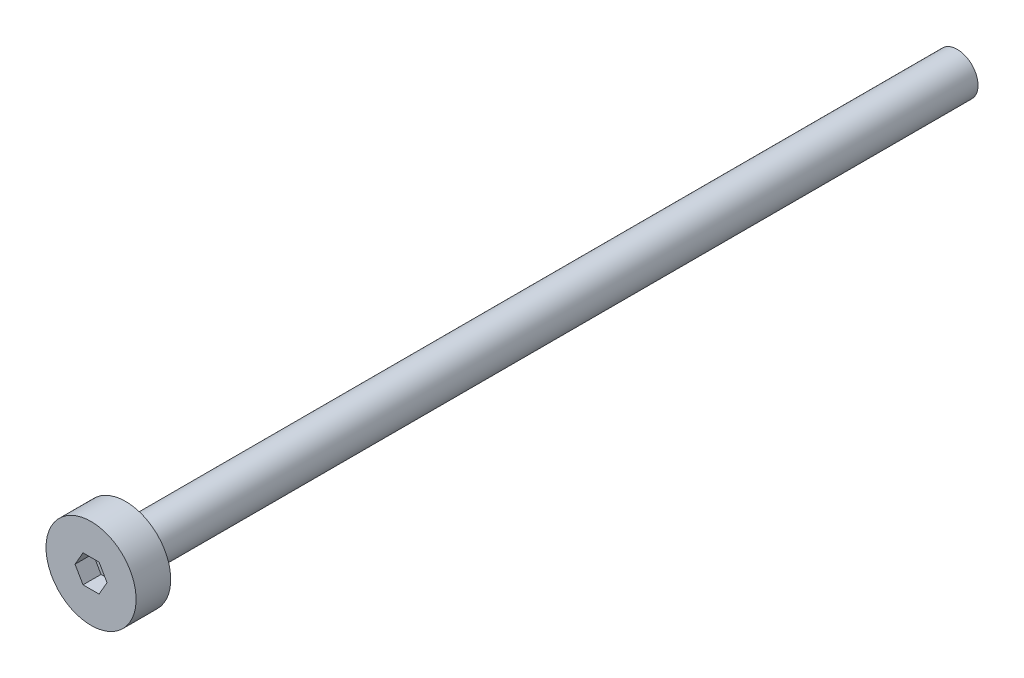
ISO-10303-21;
HEADER;
FILE_DESCRIPTION(('STEP AP214'),'2;1');
FILE_NAME('part.step','',(''),(''),'','','');
FILE_SCHEMA(('AUTOMOTIVE_DESIGN { 1 0 10303 214 1 1 1 1 }'));
ENDSEC;
DATA;
#1=APPLICATION_CONTEXT('core data for automotive mechanical design processes');
#2=APPLICATION_PROTOCOL_DEFINITION('international standard','automotive_design',2000,#1);
#3=PRODUCT_CONTEXT('',#1,'mechanical');
#4=PRODUCT('Part','Part','',(#3));
#5=PRODUCT_RELATED_PRODUCT_CATEGORY('part','',(#4));
#6=PRODUCT_DEFINITION_FORMATION('','',#4);
#7=PRODUCT_DEFINITION_CONTEXT('part definition',#1,'design');
#8=PRODUCT_DEFINITION('design','',#6,#7);
#9=PRODUCT_DEFINITION_SHAPE('','',#8);
#10=(LENGTH_UNIT() NAMED_UNIT(*) SI_UNIT(.MILLI.,.METRE.));
#11=(NAMED_UNIT(*) PLANE_ANGLE_UNIT() SI_UNIT($,.RADIAN.));
#12=(NAMED_UNIT(*) SI_UNIT($,.STERADIAN.) SOLID_ANGLE_UNIT());
#13=UNCERTAINTY_MEASURE_WITH_UNIT(LENGTH_MEASURE(1.E-05),#10,'distance_accuracy_value','');
#14=(GEOMETRIC_REPRESENTATION_CONTEXT(3) GLOBAL_UNCERTAINTY_ASSIGNED_CONTEXT((#13)) GLOBAL_UNIT_ASSIGNED_CONTEXT((#10,
#11,#12)) REPRESENTATION_CONTEXT('',''));
#15=CARTESIAN_POINT('',(0.,0.,0.));
#16=DIRECTION('',(0.,0.,1.));
#17=DIRECTION('',(1.,0.,0.));
#18=AXIS2_PLACEMENT_3D('',#15,#16,#17);
#19=CARTESIAN_POINT('',(0.,0.,1.2));
#20=DIRECTION('',(0.,0.,1.));
#21=DIRECTION('',(1.,0.,0.));
#22=AXIS2_PLACEMENT_3D('',#19,#20,#21);
#23=PLANE('',#22);
#24=DIRECTION('',(-0.50000000000019,0.866025403784329,0.));
#25=VECTOR('',#24,1.);
#26=CARTESIAN_POINT('',(1.154700538379,0.,1.2));
#27=LINE('',#26,#25);
#28=CARTESIAN_POINT('',(1.154700538379,0.,1.2));
#29=VERTEX_POINT('',#28);
#30=CARTESIAN_POINT('',(0.57735026919,1.,1.2));
#31=VERTEX_POINT('',#30);
#32=EDGE_CURVE('E9',#29,#31,#27,.T.);
#33=ORIENTED_EDGE('',*,*,#32,.T.);
#34=DIRECTION('',(-1.,0.,0.));
#35=VECTOR('',#34,1.);
#36=CARTESIAN_POINT('',(0.57735026919,1.,1.2));
#37=LINE('',#36,#35);
#38=CARTESIAN_POINT('',(-0.57735026919,1.,1.2));
#39=VERTEX_POINT('',#38);
#40=EDGE_CURVE('E135',#31,#39,#37,.T.);
#41=ORIENTED_EDGE('',*,*,#40,.T.);
#42=DIRECTION('',(-0.50000000000019,-0.866025403784329,0.));
#43=VECTOR('',#42,1.);
#44=CARTESIAN_POINT('',(-0.57735026919,1.,1.2));
#45=LINE('',#44,#43);
#46=CARTESIAN_POINT('',(-1.154700538379,0.,1.2));
#47=VERTEX_POINT('',#46);
#48=EDGE_CURVE('E157',#39,#47,#45,.T.);
#49=ORIENTED_EDGE('',*,*,#48,.T.);
#50=DIRECTION('',(0.50000000000019,-0.866025403784329,0.));
#51=VECTOR('',#50,1.);
#52=CARTESIAN_POINT('',(-1.154700538379,0.,1.2));
#53=LINE('',#52,#51);
#54=CARTESIAN_POINT('',(-0.57735026919,-1.,1.2));
#55=VERTEX_POINT('',#54);
#56=EDGE_CURVE('E107',#47,#55,#53,.T.);
#57=ORIENTED_EDGE('',*,*,#56,.T.);
#58=DIRECTION('',(1.,0.,0.));
#59=VECTOR('',#58,1.);
#60=CARTESIAN_POINT('',(-0.57735026919,-1.,1.2));
#61=LINE('',#60,#59);
#62=CARTESIAN_POINT('',(0.57735026919,-1.,1.2));
#63=VERTEX_POINT('',#62);
#64=EDGE_CURVE('E121',#55,#63,#61,.T.);
#65=ORIENTED_EDGE('',*,*,#64,.T.);
#66=DIRECTION('',(0.50000000000019,0.866025403784329,0.));
#67=VECTOR('',#66,1.);
#68=CARTESIAN_POINT('',(0.57735026919,-1.,1.2));
#69=LINE('',#68,#67);
#70=EDGE_CURVE('E117',#63,#29,#69,.T.);
#71=ORIENTED_EDGE('',*,*,#70,.T.);
#72=EDGE_LOOP('',(#33,#41,#49,#57,#65,#71));
#73=FACE_BOUND('',#72,.T.);
#74=ADVANCED_FACE('F14',(#73),#23,.T.);
#75=CARTESIAN_POINT('',(0.,0.,-60.));
#76=DIRECTION('',(0.,0.,-1.));
#77=DIRECTION('',(0.,-1.,0.));
#78=AXIS2_PLACEMENT_3D('',#75,#76,#77);
#79=PLANE('',#78);
#80=CARTESIAN_POINT('',(0.,0.,-60.));
#81=DIRECTION('',(0.,0.,-1.));
#82=DIRECTION('',(-1.,0.,0.));
#83=AXIS2_PLACEMENT_3D('',#80,#81,#82);
#84=CIRCLE('',#83,1.5);
#85=CARTESIAN_POINT('',(-1.5,0.,-60.));
#86=VERTEX_POINT('',#85);
#87=EDGE_CURVE('E18',#86,#86,#84,.T.);
#88=ORIENTED_EDGE('',*,*,#87,.T.);
#89=EDGE_LOOP('',(#88));
#90=FACE_BOUND('',#89,.T.);
#91=ADVANCED_FACE('F216',(#90),#79,.T.);
#92=CARTESIAN_POINT('',(1.154700538379,0.,1.2));
#93=DIRECTION('',(-0.866025403784329,-0.50000000000019,0.));
#94=DIRECTION('',(-0.50000000000019,0.866025403784329,0.));
#95=AXIS2_PLACEMENT_3D('',#92,#93,#94);
#96=PLANE('',#95);
#97=ORIENTED_EDGE('',*,*,#32,.F.);
#98=DIRECTION('',(0.,0.,1.));
#99=VECTOR('',#98,1.);
#100=CARTESIAN_POINT('',(1.154700538379,0.,1.2));
#101=LINE('',#100,#99);
#102=CARTESIAN_POINT('',(1.154700538379,0.,2.5));
#103=VERTEX_POINT('',#102);
#104=EDGE_CURVE('E114',#29,#103,#101,.T.);
#105=ORIENTED_EDGE('',*,*,#104,.T.);
#106=DIRECTION('',(-0.50000000000019,0.866025403784329,0.));
#107=VECTOR('',#106,1.);
#108=CARTESIAN_POINT('',(1.010362971082,0.25,2.5));
#109=LINE('',#108,#107);
#110=CARTESIAN_POINT('',(0.57735026919,1.,2.5));
#111=VERTEX_POINT('',#110);
#112=EDGE_CURVE('E150',#103,#111,#109,.T.);
#113=ORIENTED_EDGE('',*,*,#112,.T.);
#114=DIRECTION('',(0.,0.,1.));
#115=VECTOR('',#114,1.);
#116=CARTESIAN_POINT('',(0.57735026919,1.,1.2));
#117=LINE('',#116,#115);
#118=EDGE_CURVE('E25',#31,#111,#117,.T.);
#119=ORIENTED_EDGE('',*,*,#118,.F.);
#120=EDGE_LOOP('',(#97,#105,#113,#119));
#121=FACE_BOUND('',#120,.T.);
#122=ADVANCED_FACE('F112',(#121),#96,.T.);
#123=CARTESIAN_POINT('',(0.57735026919,1.,1.2));
#124=DIRECTION('',(0.,-1.,0.));
#125=DIRECTION('',(-1.,0.,0.));
#126=AXIS2_PLACEMENT_3D('',#123,#124,#125);
#127=PLANE('',#126);
#128=ORIENTED_EDGE('',*,*,#40,.F.);
#129=ORIENTED_EDGE('',*,*,#118,.T.);
#130=DIRECTION('',(-1.,0.,0.));
#131=VECTOR('',#130,1.);
#132=CARTESIAN_POINT('',(0.288675134595,1.,2.5));
#133=LINE('',#132,#131);
#134=CARTESIAN_POINT('',(-0.57735026919,1.,2.5));
#135=VERTEX_POINT('',#134);
#136=EDGE_CURVE('E140',#111,#135,#133,.T.);
#137=ORIENTED_EDGE('',*,*,#136,.T.);
#138=DIRECTION('',(0.,0.,1.));
#139=VECTOR('',#138,1.);
#140=CARTESIAN_POINT('',(-0.57735026919,1.,1.2));
#141=LINE('',#140,#139);
#142=EDGE_CURVE('E156',#39,#135,#141,.T.);
#143=ORIENTED_EDGE('',*,*,#142,.F.);
#144=EDGE_LOOP('',(#128,#129,#137,#143));
#145=FACE_BOUND('',#144,.T.);
#146=ADVANCED_FACE('F191',(#145),#127,.T.);
#147=CARTESIAN_POINT('',(-0.57735026919,1.,1.2));
#148=DIRECTION('',(0.866025403784329,-0.50000000000019,0.));
#149=DIRECTION('',(0.,0.,-1.));
#150=AXIS2_PLACEMENT_3D('',#147,#148,#149);
#151=PLANE('',#150);
#152=ORIENTED_EDGE('',*,*,#48,.F.);
#153=ORIENTED_EDGE('',*,*,#142,.T.);
#154=DIRECTION('',(-0.50000000000019,-0.866025403784329,0.));
#155=VECTOR('',#154,1.);
#156=CARTESIAN_POINT('',(-0.721687836487,0.75,2.5));
#157=LINE('',#156,#155);
#158=CARTESIAN_POINT('',(-1.154700538379,0.,2.5));
#159=VERTEX_POINT('',#158);
#160=EDGE_CURVE('E136',#135,#159,#157,.T.);
#161=ORIENTED_EDGE('',*,*,#160,.T.);
#162=DIRECTION('',(0.,0.,1.));
#163=VECTOR('',#162,1.);
#164=CARTESIAN_POINT('',(-1.154700538379,0.,1.2));
#165=LINE('',#164,#163);
#166=EDGE_CURVE('E160',#47,#159,#165,.T.);
#167=ORIENTED_EDGE('',*,*,#166,.F.);
#168=EDGE_LOOP('',(#152,#153,#161,#167));
#169=FACE_BOUND('',#168,.T.);
#170=ADVANCED_FACE('F200',(#169),#151,.T.);
#171=CARTESIAN_POINT('',(-1.154700538379,0.,1.2));
#172=DIRECTION('',(0.866025403784329,0.50000000000019,0.));
#173=DIRECTION('',(0.,0.,-1.));
#174=AXIS2_PLACEMENT_3D('',#171,#172,#173);
#175=PLANE('',#174);
#176=ORIENTED_EDGE('',*,*,#56,.F.);
#177=ORIENTED_EDGE('',*,*,#166,.T.);
#178=DIRECTION('',(0.50000000000019,-0.866025403784329,0.));
#179=VECTOR('',#178,1.);
#180=CARTESIAN_POINT('',(-1.010362971082,-0.25,2.5));
#181=LINE('',#180,#179);
#182=CARTESIAN_POINT('',(-0.57735026919,-1.,2.5));
#183=VERTEX_POINT('',#182);
#184=EDGE_CURVE('E141',#159,#183,#181,.T.);
#185=ORIENTED_EDGE('',*,*,#184,.T.);
#186=DIRECTION('',(0.,0.,1.));
#187=VECTOR('',#186,1.);
#188=CARTESIAN_POINT('',(-0.57735026919,-1.,1.2));
#189=LINE('',#188,#187);
#190=EDGE_CURVE('E80',#55,#183,#189,.T.);
#191=ORIENTED_EDGE('',*,*,#190,.F.);
#192=EDGE_LOOP('',(#176,#177,#185,#191));
#193=FACE_BOUND('',#192,.T.);
#194=ADVANCED_FACE('F202',(#193),#175,.T.);
#195=CARTESIAN_POINT('',(-0.57735026919,-1.,1.2));
#196=DIRECTION('',(0.,1.,0.));
#197=DIRECTION('',(1.,0.,0.));
#198=AXIS2_PLACEMENT_3D('',#195,#196,#197);
#199=PLANE('',#198);
#200=ORIENTED_EDGE('',*,*,#64,.F.);
#201=ORIENTED_EDGE('',*,*,#190,.T.);
#202=DIRECTION('',(1.,0.,0.));
#203=VECTOR('',#202,1.);
#204=CARTESIAN_POINT('',(-0.288675134595,-1.,2.5));
#205=LINE('',#204,#203);
#206=CARTESIAN_POINT('',(0.57735026919,-1.,2.5));
#207=VERTEX_POINT('',#206);
#208=EDGE_CURVE('E146',#183,#207,#205,.T.);
#209=ORIENTED_EDGE('',*,*,#208,.T.);
#210=DIRECTION('',(0.,0.,1.));
#211=VECTOR('',#210,1.);
#212=CARTESIAN_POINT('',(0.57735026919,-1.,1.2));
#213=LINE('',#212,#211);
#214=EDGE_CURVE('E64',#63,#207,#213,.T.);
#215=ORIENTED_EDGE('',*,*,#214,.F.);
#216=EDGE_LOOP('',(#200,#201,#209,#215));
#217=FACE_BOUND('',#216,.T.);
#218=ADVANCED_FACE('F203',(#217),#199,.T.);
#219=CARTESIAN_POINT('',(0.57735026919,-1.,1.2));
#220=DIRECTION('',(-0.866025403784329,0.50000000000019,0.));
#221=DIRECTION('',(0.,0.,1.));
#222=AXIS2_PLACEMENT_3D('',#219,#220,#221);
#223=PLANE('',#222);
#224=ORIENTED_EDGE('',*,*,#70,.F.);
#225=ORIENTED_EDGE('',*,*,#214,.T.);
#226=DIRECTION('',(0.50000000000019,0.866025403784329,0.));
#227=VECTOR('',#226,1.);
#228=CARTESIAN_POINT('',(0.721687836487,-0.75,2.5));
#229=LINE('',#228,#227);
#230=EDGE_CURVE('E118',#207,#103,#229,.T.);
#231=ORIENTED_EDGE('',*,*,#230,.T.);
#232=ORIENTED_EDGE('',*,*,#104,.F.);
#233=EDGE_LOOP('',(#224,#225,#231,#232));
#234=FACE_BOUND('',#233,.T.);
#235=ADVANCED_FACE('F16',(#234),#223,.T.);
#236=CARTESIAN_POINT('',(0.,0.,0.));
#237=DIRECTION('',(0.,0.,-1.));
#238=DIRECTION('',(-1.,0.,0.));
#239=AXIS2_PLACEMENT_3D('',#236,#237,#238);
#240=CYLINDRICAL_SURFACE('',#239,1.5);
#241=ORIENTED_EDGE('',*,*,#87,.F.);
#242=DIRECTION('',(0.,0.,-1.));
#243=VECTOR('',#242,1.);
#244=CARTESIAN_POINT('',(-1.5,0.,0.));
#245=LINE('',#244,#243);
#246=CARTESIAN_POINT('',(-1.5,0.,0.));
#247=VERTEX_POINT('',#246);
#248=EDGE_CURVE('E124',#247,#86,#245,.T.);
#249=ORIENTED_EDGE('',*,*,#248,.F.);
#250=CARTESIAN_POINT('',(0.,0.,0.));
#251=DIRECTION('',(0.,0.,-1.));
#252=DIRECTION('',(-1.,0.,0.));
#253=AXIS2_PLACEMENT_3D('',#250,#251,#252);
#254=CIRCLE('',#253,1.5);
#255=EDGE_CURVE('E142',#247,#247,#254,.T.);
#256=ORIENTED_EDGE('',*,*,#255,.T.);
#257=ORIENTED_EDGE('',*,*,#248,.T.);
#258=EDGE_LOOP('',(#241,#249,#256,#257));
#259=FACE_BOUND('',#258,.T.);
#260=ADVANCED_FACE('F211',(#259),#240,.T.);
#261=CARTESIAN_POINT('',(0.,0.,2.5));
#262=DIRECTION('',(0.,0.,-1.));
#263=DIRECTION('',(0.,-1.,0.));
#264=AXIS2_PLACEMENT_3D('',#261,#262,#263);
#265=PLANE('',#264);
#266=ORIENTED_EDGE('',*,*,#208,.F.);
#267=ORIENTED_EDGE('',*,*,#184,.F.);
#268=ORIENTED_EDGE('',*,*,#160,.F.);
#269=ORIENTED_EDGE('',*,*,#136,.F.);
#270=ORIENTED_EDGE('',*,*,#112,.F.);
#271=ORIENTED_EDGE('',*,*,#230,.F.);
#272=EDGE_LOOP('',(#266,#267,#268,#269,#270,#271));
#273=FACE_BOUND('',#272,.T.);
#274=CARTESIAN_POINT('',(0.,0.,2.5));
#275=DIRECTION('',(0.,0.,-1.));
#276=DIRECTION('',(-1.,0.,0.));
#277=AXIS2_PLACEMENT_3D('',#274,#275,#276);
#278=CIRCLE('',#277,3.25);
#279=CARTESIAN_POINT('',(-3.25,0.,2.5));
#280=VERTEX_POINT('',#279);
#281=EDGE_CURVE('E147',#280,#280,#278,.T.);
#282=ORIENTED_EDGE('',*,*,#281,.F.);
#283=EDGE_LOOP('',(#282));
#284=FACE_BOUND('',#283,.T.);
#285=ADVANCED_FACE('F196',(#273,#284),#265,.F.);
#286=CARTESIAN_POINT('',(0.,0.,0.));
#287=DIRECTION('',(0.,0.,-1.));
#288=DIRECTION('',(0.,-1.,0.));
#289=AXIS2_PLACEMENT_3D('',#286,#287,#288);
#290=PLANE('',#289);
#291=ORIENTED_EDGE('',*,*,#255,.F.);
#292=EDGE_LOOP('',(#291));
#293=FACE_BOUND('',#292,.T.);
#294=CARTESIAN_POINT('',(0.,0.,0.));
#295=DIRECTION('',(0.,0.,-1.));
#296=DIRECTION('',(-1.,0.,0.));
#297=AXIS2_PLACEMENT_3D('',#294,#295,#296);
#298=CIRCLE('',#297,3.25);
#299=CARTESIAN_POINT('',(-3.25,0.,0.));
#300=VERTEX_POINT('',#299);
#301=EDGE_CURVE('E180',#300,#300,#298,.T.);
#302=ORIENTED_EDGE('',*,*,#301,.T.);
#303=EDGE_LOOP('',(#302));
#304=FACE_BOUND('',#303,.T.);
#305=ADVANCED_FACE('F225',(#293,#304),#290,.T.);
#306=CARTESIAN_POINT('',(0.,0.,2.5));
#307=DIRECTION('',(0.,0.,-1.));
#308=DIRECTION('',(-1.,0.,0.));
#309=AXIS2_PLACEMENT_3D('',#306,#307,#308);
#310=CYLINDRICAL_SURFACE('',#309,3.25);
#311=ORIENTED_EDGE('',*,*,#301,.F.);
#312=DIRECTION('',(0.,0.,-1.));
#313=VECTOR('',#312,1.);
#314=CARTESIAN_POINT('',(-3.25,0.,2.5));
#315=LINE('',#314,#313);
#316=EDGE_CURVE('E152',#280,#300,#315,.T.);
#317=ORIENTED_EDGE('',*,*,#316,.F.);
#318=ORIENTED_EDGE('',*,*,#281,.T.);
#319=ORIENTED_EDGE('',*,*,#316,.T.);
#320=EDGE_LOOP('',(#311,#317,#318,#319));
#321=FACE_BOUND('',#320,.T.);
#322=ADVANCED_FACE('F237',(#321),#310,.T.);
#323=CLOSED_SHELL('',(#74,#91,#122,#146,#170,#194,#218,#235,#260,#285,#305,#322));
#324=MANIFOLD_SOLID_BREP('B1',#323);
#325=ADVANCED_BREP_SHAPE_REPRESENTATION('',(#18,#324),#14);
#326=SHAPE_DEFINITION_REPRESENTATION(#9,#325);
ENDSEC;
END-ISO-10303-21;
